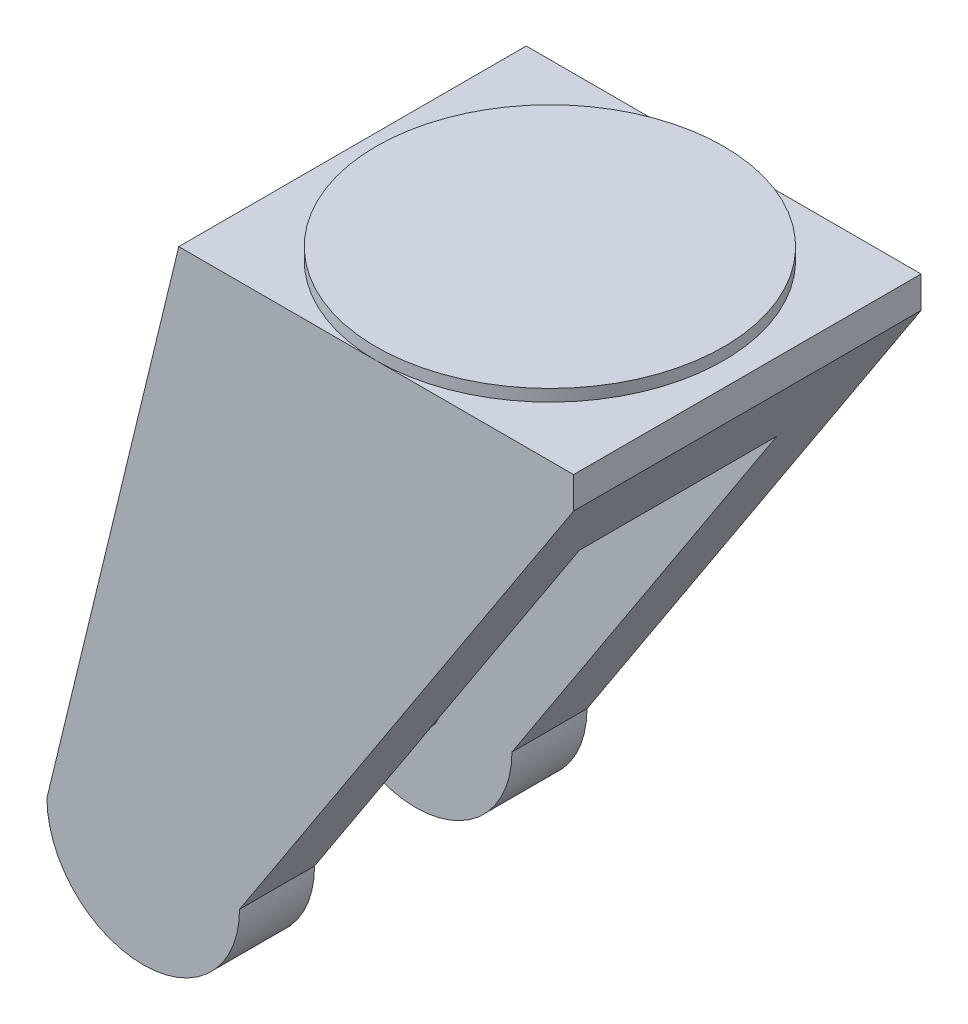
ISO-10303-21;
HEADER;
FILE_DESCRIPTION(('STEP AP214'),'2;1');
FILE_NAME('part.step','',(''),(''),'','','');
FILE_SCHEMA(('AUTOMOTIVE_DESIGN { 1 0 10303 214 1 1 1 1 }'));
ENDSEC;
DATA;
#1=APPLICATION_CONTEXT('core data for automotive mechanical design processes');
#2=APPLICATION_PROTOCOL_DEFINITION('international standard','automotive_design',2000,#1);
#3=PRODUCT_CONTEXT('',#1,'mechanical');
#4=PRODUCT('Part','Part','',(#3));
#5=PRODUCT_RELATED_PRODUCT_CATEGORY('part','',(#4));
#6=PRODUCT_DEFINITION_FORMATION('','',#4);
#7=PRODUCT_DEFINITION_CONTEXT('part definition',#1,'design');
#8=PRODUCT_DEFINITION('design','',#6,#7);
#9=PRODUCT_DEFINITION_SHAPE('','',#8);
#10=(LENGTH_UNIT() NAMED_UNIT(*) SI_UNIT(.MILLI.,.METRE.));
#11=(NAMED_UNIT(*) PLANE_ANGLE_UNIT() SI_UNIT($,.RADIAN.));
#12=(NAMED_UNIT(*) SI_UNIT($,.STERADIAN.) SOLID_ANGLE_UNIT());
#13=UNCERTAINTY_MEASURE_WITH_UNIT(LENGTH_MEASURE(1.E-05),#10,'distance_accuracy_value','');
#14=(GEOMETRIC_REPRESENTATION_CONTEXT(3) GLOBAL_UNCERTAINTY_ASSIGNED_CONTEXT((#13)) GLOBAL_UNIT_ASSIGNED_CONTEXT((#10,
#11,#12)) REPRESENTATION_CONTEXT('',''));
#15=CARTESIAN_POINT('',(0.,0.,0.));
#16=DIRECTION('',(0.,0.,1.));
#17=DIRECTION('',(1.,0.,0.));
#18=AXIS2_PLACEMENT_3D('',#15,#16,#17);
#19=CARTESIAN_POINT('',(-50.,3.99999999999999,88.));
#20=DIRECTION('',(0.,-1.,0.));
#21=DIRECTION('',(1.,0.,0.));
#22=AXIS2_PLACEMENT_3D('',#19,#20,#21);
#23=PLANE('',#22);
#24=CARTESIAN_POINT('',(0.,4.,44.));
#25=DIRECTION('',(0.,1.,0.));
#26=DIRECTION('',(-1.,0.,0.));
#27=AXIS2_PLACEMENT_3D('',#24,#25,#26);
#28=CIRCLE('',#27,44.);
#29=CARTESIAN_POINT('',(0.,4.,88.));
#30=VERTEX_POINT('',#29);
#31=CARTESIAN_POINT('',(0.,4.,0.));
#32=VERTEX_POINT('',#31);
#33=EDGE_CURVE('E44',#30,#32,#28,.T.);
#34=ORIENTED_EDGE('',*,*,#33,.F.);
#35=DIRECTION('',(-1.,0.,0.));
#36=VECTOR('',#35,1.);
#37=CARTESIAN_POINT('',(-50.,3.99999999999999,88.));
#38=LINE('',#37,#36);
#39=CARTESIAN_POINT('',(50.,4.00000000000001,88.));
#40=VERTEX_POINT('',#39);
#41=EDGE_CURVE('E112',#40,#30,#38,.T.);
#42=ORIENTED_EDGE('',*,*,#41,.F.);
#43=DIRECTION('',(0.,0.,-1.));
#44=VECTOR('',#43,1.);
#45=CARTESIAN_POINT('',(50.,4.00000000000001,88.));
#46=LINE('',#45,#44);
#47=CARTESIAN_POINT('',(50.,4.00000000000001,0.));
#48=VERTEX_POINT('',#47);
#49=EDGE_CURVE('E175',#40,#48,#46,.T.);
#50=ORIENTED_EDGE('',*,*,#49,.T.);
#51=DIRECTION('',(-1.,0.,0.));
#52=VECTOR('',#51,1.);
#53=CARTESIAN_POINT('',(-50.,3.99999999999999,0.));
#54=LINE('',#53,#52);
#55=EDGE_CURVE('E131',#48,#32,#54,.T.);
#56=ORIENTED_EDGE('',*,*,#55,.T.);
#57=EDGE_LOOP('',(#34,#42,#50,#56));
#58=FACE_BOUND('',#57,.T.);
#59=ADVANCED_FACE('F34',(#58),#23,.F.);
#60=CARTESIAN_POINT('',(-59.,-133.65,88.));
#61=DIRECTION('',(0.,0.,-1.));
#62=DIRECTION('',(-1.,0.,0.));
#63=AXIS2_PLACEMENT_3D('',#60,#61,#62);
#64=CYLINDRICAL_SURFACE('',#63,24.39);
#65=DIRECTION('',(0.,0.,-1.));
#66=VECTOR('',#65,1.);
#67=CARTESIAN_POINT('',(-83.39,-133.65,88.));
#68=LINE('',#67,#66);
#69=CARTESIAN_POINT('',(-83.39,-133.65,88.));
#70=VERTEX_POINT('',#69);
#71=CARTESIAN_POINT('',(-83.39,-133.65,69.0000000000001));
#72=VERTEX_POINT('',#71);
#73=EDGE_CURVE('E202',#70,#72,#68,.T.);
#74=ORIENTED_EDGE('',*,*,#73,.T.);
#75=CARTESIAN_POINT('',(-59.,-133.65,69.));
#76=DIRECTION('',(0.,0.,1.));
#77=DIRECTION('',(0.,-1.,0.));
#78=AXIS2_PLACEMENT_3D('',#75,#76,#77);
#79=CIRCLE('',#78,24.39);
#80=CARTESIAN_POINT('',(-34.61,-133.65,69.));
#81=VERTEX_POINT('',#80);
#82=EDGE_CURVE('E208',#72,#81,#79,.T.);
#83=ORIENTED_EDGE('',*,*,#82,.T.);
#84=DIRECTION('',(0.,0.,-1.));
#85=VECTOR('',#84,1.);
#86=CARTESIAN_POINT('',(-34.61,-133.65,88.));
#87=LINE('',#86,#85);
#88=CARTESIAN_POINT('',(-34.61,-133.65,88.));
#89=VERTEX_POINT('',#88);
#90=EDGE_CURVE('E197',#89,#81,#87,.T.);
#91=ORIENTED_EDGE('',*,*,#90,.F.);
#92=CARTESIAN_POINT('',(-59.,-133.65,88.));
#93=DIRECTION('',(0.,0.,1.));
#94=DIRECTION('',(1.,0.,0.));
#95=AXIS2_PLACEMENT_3D('',#92,#93,#94);
#96=CIRCLE('',#95,24.39);
#97=EDGE_CURVE('E244',#70,#89,#96,.T.);
#98=ORIENTED_EDGE('',*,*,#97,.F.);
#99=EDGE_LOOP('',(#74,#83,#91,#98));
#100=FACE_BOUND('',#99,.T.);
#101=ADVANCED_FACE('F151',(#100),#64,.T.);
#102=CARTESIAN_POINT('',(50.,-3.99999999999999,88.));
#103=DIRECTION('',(-0.837446078446311,0.546519959100211,0.));
#104=DIRECTION('',(-0.546519959100211,-0.837446078446311,0.));
#105=AXIS2_PLACEMENT_3D('',#102,#103,#104);
#106=PLANE('',#105);
#107=ORIENTED_EDGE('',*,*,#90,.T.);
#108=DIRECTION('',(0.546519959100211,0.837446078446311,0.));
#109=VECTOR('',#108,1.);
#110=CARTESIAN_POINT('',(50.,-3.99999999999999,69.));
#111=LINE('',#110,#109);
#112=CARTESIAN_POINT('',(32.4808681064405,-30.8449999999999,69.));
#113=VERTEX_POINT('',#112);
#114=EDGE_CURVE('E236',#81,#113,#111,.T.);
#115=ORIENTED_EDGE('',*,*,#114,.T.);
#116=DIRECTION('',(0.,0.,-1.));
#117=VECTOR('',#116,1.);
#118=CARTESIAN_POINT('',(32.4808681064405,-30.8449999999999,88.));
#119=LINE('',#118,#117);
#120=CARTESIAN_POINT('',(32.4808681064404,-30.845,19.));
#121=VERTEX_POINT('',#120);
#122=EDGE_CURVE('E239',#113,#121,#119,.T.);
#123=ORIENTED_EDGE('',*,*,#122,.T.);
#124=DIRECTION('',(-0.546519959100211,-0.837446078446311,0.));
#125=VECTOR('',#124,1.);
#126=CARTESIAN_POINT('',(50.,-3.99999999999999,19.));
#127=LINE('',#126,#125);
#128=CARTESIAN_POINT('',(-34.61,-133.65,19.));
#129=VERTEX_POINT('',#128);
#130=EDGE_CURVE('E225',#121,#129,#127,.T.);
#131=ORIENTED_EDGE('',*,*,#130,.T.);
#132=CARTESIAN_POINT('',(-34.61,-133.65,0.));
#133=VERTEX_POINT('',#132);
#134=EDGE_CURVE('E201',#129,#133,#87,.T.);
#135=ORIENTED_EDGE('',*,*,#134,.T.);
#136=DIRECTION('',(0.546519959100211,0.837446078446311,0.));
#137=VECTOR('',#136,1.);
#138=CARTESIAN_POINT('',(50.,-3.99999999999999,0.));
#139=LINE('',#138,#137);
#140=CARTESIAN_POINT('',(50.,-3.99999999999999,0.));
#141=VERTEX_POINT('',#140);
#142=EDGE_CURVE('E182',#133,#141,#139,.T.);
#143=ORIENTED_EDGE('',*,*,#142,.T.);
#144=DIRECTION('',(0.,0.,-1.));
#145=VECTOR('',#144,1.);
#146=CARTESIAN_POINT('',(50.,-3.99999999999999,88.));
#147=LINE('',#146,#145);
#148=CARTESIAN_POINT('',(50.,-3.99999999999999,88.));
#149=VERTEX_POINT('',#148);
#150=EDGE_CURVE('E177',#149,#141,#147,.T.);
#151=ORIENTED_EDGE('',*,*,#150,.F.);
#152=DIRECTION('',(0.546519959100211,0.837446078446311,0.));
#153=VECTOR('',#152,1.);
#154=CARTESIAN_POINT('',(50.,-3.99999999999999,88.));
#155=LINE('',#154,#153);
#156=EDGE_CURVE('E196',#89,#149,#155,.T.);
#157=ORIENTED_EDGE('',*,*,#156,.F.);
#158=EDGE_LOOP('',(#107,#115,#123,#131,#135,#143,#151,#157));
#159=FACE_BOUND('',#158,.T.);
#160=ADVANCED_FACE('F36',(#159),#106,.F.);
#161=CARTESIAN_POINT('',(50.,4.00000000000001,88.));
#162=DIRECTION('',(-1.,0.,0.));
#163=DIRECTION('',(0.,0.,1.));
#164=AXIS2_PLACEMENT_3D('',#161,#162,#163);
#165=PLANE('',#164);
#166=DIRECTION('',(0.,1.,0.));
#167=VECTOR('',#166,1.);
#168=CARTESIAN_POINT('',(50.,4.00000000000001,0.));
#169=LINE('',#168,#167);
#170=EDGE_CURVE('E174',#141,#48,#169,.T.);
#171=ORIENTED_EDGE('',*,*,#170,.T.);
#172=ORIENTED_EDGE('',*,*,#49,.F.);
#173=DIRECTION('',(0.,1.,0.));
#174=VECTOR('',#173,1.);
#175=CARTESIAN_POINT('',(50.,4.00000000000001,88.));
#176=LINE('',#175,#174);
#177=EDGE_CURVE('E117',#149,#40,#176,.T.);
#178=ORIENTED_EDGE('',*,*,#177,.F.);
#179=ORIENTED_EDGE('',*,*,#150,.T.);
#180=EDGE_LOOP('',(#171,#172,#178,#179));
#181=FACE_BOUND('',#180,.T.);
#182=ADVANCED_FACE('F162',(#181),#165,.F.);
#183=EDGE_CURVE('E11',#32,#30,#28,.T.);
#184=ORIENTED_EDGE('',*,*,#183,.F.);
#185=CARTESIAN_POINT('',(-50.,3.99999999999999,0.));
#186=VERTEX_POINT('',#185);
#187=EDGE_CURVE('E181',#32,#186,#54,.T.);
#188=ORIENTED_EDGE('',*,*,#187,.T.);
#189=DIRECTION('',(0.,0.,-1.));
#190=VECTOR('',#189,1.);
#191=CARTESIAN_POINT('',(-50.,3.99999999999999,88.));
#192=LINE('',#191,#190);
#193=CARTESIAN_POINT('',(-50.,3.99999999999999,88.));
#194=VERTEX_POINT('',#193);
#195=EDGE_CURVE('E126',#194,#186,#192,.T.);
#196=ORIENTED_EDGE('',*,*,#195,.F.);
#197=EDGE_CURVE('E115',#30,#194,#38,.T.);
#198=ORIENTED_EDGE('',*,*,#197,.F.);
#199=EDGE_LOOP('',(#184,#188,#196,#198));
#200=FACE_BOUND('',#199,.T.);
#201=ADVANCED_FACE('F124',(#200),#23,.F.);
#202=CARTESIAN_POINT('',(-50.,3.99999999999999,88.));
#203=DIRECTION('',(0.971817275857904,-0.235735407489251,0.));
#204=DIRECTION('',(0.235735407489251,0.971817275857904,0.));
#205=AXIS2_PLACEMENT_3D('',#202,#203,#204);
#206=PLANE('',#205);
#207=DIRECTION('',(0.,0.,1.));
#208=VECTOR('',#207,1.);
#209=CARTESIAN_POINT('',(-58.4524122775154,-30.8449999999999,88.));
#210=LINE('',#209,#208);
#211=CARTESIAN_POINT('',(-58.4524122775154,-30.8449999999999,19.));
#212=VERTEX_POINT('',#211);
#213=CARTESIAN_POINT('',(-58.4524122775154,-30.8449999999999,69.));
#214=VERTEX_POINT('',#213);
#215=EDGE_CURVE('E38',#212,#214,#210,.T.);
#216=ORIENTED_EDGE('',*,*,#215,.T.);
#217=DIRECTION('',(-0.235735407489251,-0.971817275857904,0.));
#218=VECTOR('',#217,1.);
#219=CARTESIAN_POINT('',(-50.,4.,69.));
#220=LINE('',#219,#218);
#221=EDGE_CURVE('E214',#214,#72,#220,.T.);
#222=ORIENTED_EDGE('',*,*,#221,.T.);
#223=ORIENTED_EDGE('',*,*,#73,.F.);
#224=DIRECTION('',(-0.235735407489251,-0.971817275857904,0.));
#225=VECTOR('',#224,1.);
#226=CARTESIAN_POINT('',(-50.,3.99999999999999,88.));
#227=LINE('',#226,#225);
#228=EDGE_CURVE('E122',#194,#70,#227,.T.);
#229=ORIENTED_EDGE('',*,*,#228,.F.);
#230=ORIENTED_EDGE('',*,*,#195,.T.);
#231=DIRECTION('',(-0.235735407489251,-0.971817275857904,0.));
#232=VECTOR('',#231,1.);
#233=CARTESIAN_POINT('',(-50.,3.99999999999999,0.));
#234=LINE('',#233,#232);
#235=CARTESIAN_POINT('',(-83.39,-133.65,0.));
#236=VERTEX_POINT('',#235);
#237=EDGE_CURVE('E187',#186,#236,#234,.T.);
#238=ORIENTED_EDGE('',*,*,#237,.T.);
#239=CARTESIAN_POINT('',(-83.39,-133.65,19.));
#240=VERTEX_POINT('',#239);
#241=EDGE_CURVE('E200',#240,#236,#68,.T.);
#242=ORIENTED_EDGE('',*,*,#241,.F.);
#243=DIRECTION('',(0.235735407489251,0.971817275857904,0.));
#244=VECTOR('',#243,1.);
#245=CARTESIAN_POINT('',(-50.,3.99999999999999,19.));
#246=LINE('',#245,#244);
#247=EDGE_CURVE('E57',#240,#212,#246,.T.);
#248=ORIENTED_EDGE('',*,*,#247,.T.);
#249=EDGE_LOOP('',(#216,#222,#223,#229,#230,#238,#242,#248));
#250=FACE_BOUND('',#249,.T.);
#251=ADVANCED_FACE('F161',(#250),#206,.F.);
#252=ORIENTED_EDGE('',*,*,#134,.F.);
#253=CARTESIAN_POINT('',(-59.,-133.65,19.));
#254=DIRECTION('',(0.,0.,-1.));
#255=DIRECTION('',(-1.,0.,0.));
#256=AXIS2_PLACEMENT_3D('',#253,#254,#255);
#257=CIRCLE('',#256,24.39);
#258=EDGE_CURVE('E207',#129,#240,#257,.T.);
#259=ORIENTED_EDGE('',*,*,#258,.T.);
#260=ORIENTED_EDGE('',*,*,#241,.T.);
#261=CARTESIAN_POINT('',(-59.,-133.65,0.));
#262=DIRECTION('',(0.,0.,1.));
#263=DIRECTION('',(1.,0.,0.));
#264=AXIS2_PLACEMENT_3D('',#261,#262,#263);
#265=CIRCLE('',#264,24.39);
#266=EDGE_CURVE('E190',#236,#133,#265,.T.);
#267=ORIENTED_EDGE('',*,*,#266,.T.);
#268=EDGE_LOOP('',(#252,#259,#260,#267));
#269=FACE_BOUND('',#268,.T.);
#270=ADVANCED_FACE('F158',(#269),#64,.T.);
#271=CARTESIAN_POINT('',(-59.,-133.65,88.));
#272=DIRECTION('',(0.,0.,1.));
#273=DIRECTION('',(1.,0.,0.));
#274=AXIS2_PLACEMENT_3D('',#271,#272,#273);
#275=PLANE('',#274);
#276=ORIENTED_EDGE('',*,*,#156,.T.);
#277=ORIENTED_EDGE('',*,*,#177,.T.);
#278=ORIENTED_EDGE('',*,*,#41,.T.);
#279=ORIENTED_EDGE('',*,*,#197,.T.);
#280=ORIENTED_EDGE('',*,*,#228,.T.);
#281=ORIENTED_EDGE('',*,*,#97,.T.);
#282=EDGE_LOOP('',(#276,#277,#278,#279,#280,#281));
#283=FACE_BOUND('',#282,.T.);
#284=ADVANCED_FACE('F114',(#283),#275,.T.);
#285=CARTESIAN_POINT('',(-59.,-133.65,0.));
#286=DIRECTION('',(0.,0.,1.));
#287=DIRECTION('',(1.,0.,0.));
#288=AXIS2_PLACEMENT_3D('',#285,#286,#287);
#289=PLANE('',#288);
#290=ORIENTED_EDGE('',*,*,#142,.F.);
#291=ORIENTED_EDGE('',*,*,#266,.F.);
#292=ORIENTED_EDGE('',*,*,#237,.F.);
#293=ORIENTED_EDGE('',*,*,#187,.F.);
#294=ORIENTED_EDGE('',*,*,#55,.F.);
#295=ORIENTED_EDGE('',*,*,#170,.F.);
#296=EDGE_LOOP('',(#290,#291,#292,#293,#294,#295));
#297=FACE_BOUND('',#296,.T.);
#298=ADVANCED_FACE('F185',(#297),#289,.F.);
#299=CARTESIAN_POINT('',(-83.39,-30.8449999999999,69.));
#300=DIRECTION('',(0.,1.,0.));
#301=DIRECTION('',(0.,0.,1.));
#302=AXIS2_PLACEMENT_3D('',#299,#300,#301);
#303=PLANE('',#302);
#304=DIRECTION('',(1.,0.,0.));
#305=VECTOR('',#304,1.);
#306=CARTESIAN_POINT('',(-83.39,-30.8449999999999,69.));
#307=LINE('',#306,#305);
#308=EDGE_CURVE('E223',#214,#113,#307,.T.);
#309=ORIENTED_EDGE('',*,*,#308,.F.);
#310=ORIENTED_EDGE('',*,*,#215,.F.);
#311=DIRECTION('',(1.,0.,0.));
#312=VECTOR('',#311,1.);
#313=CARTESIAN_POINT('',(-83.39,-30.8449999999999,19.));
#314=LINE('',#313,#312);
#315=EDGE_CURVE('E220',#212,#121,#314,.T.);
#316=ORIENTED_EDGE('',*,*,#315,.T.);
#317=ORIENTED_EDGE('',*,*,#122,.F.);
#318=EDGE_LOOP('',(#309,#310,#316,#317));
#319=FACE_BOUND('',#318,.T.);
#320=ADVANCED_FACE('F219',(#319),#303,.F.);
#321=CARTESIAN_POINT('',(-83.39,-45.8449999999999,69.));
#322=DIRECTION('',(0.,0.,1.));
#323=DIRECTION('',(0.,-1.,0.));
#324=AXIS2_PLACEMENT_3D('',#321,#322,#323);
#325=PLANE('',#324);
#326=CARTESIAN_POINT('',(-59.,-133.65,69.));
#327=DIRECTION('',(0.,0.,1.));
#328=DIRECTION('',(0.,-1.,0.));
#329=AXIS2_PLACEMENT_3D('',#326,#327,#328);
#330=CIRCLE('',#329,6.05);
#331=CARTESIAN_POINT('',(-59.,-139.7,69.));
#332=VERTEX_POINT('',#331);
#333=EDGE_CURVE('E226',#332,#332,#330,.T.);
#334=ORIENTED_EDGE('',*,*,#333,.T.);
#335=EDGE_LOOP('',(#334));
#336=FACE_BOUND('',#335,.T.);
#337=ORIENTED_EDGE('',*,*,#82,.F.);
#338=ORIENTED_EDGE('',*,*,#221,.F.);
#339=ORIENTED_EDGE('',*,*,#308,.T.);
#340=ORIENTED_EDGE('',*,*,#114,.F.);
#341=EDGE_LOOP('',(#337,#338,#339,#340));
#342=FACE_BOUND('',#341,.T.);
#343=ADVANCED_FACE('F251',(#336,#342),#325,.F.);
#344=CARTESIAN_POINT('',(-83.39,-30.8449999999999,19.));
#345=DIRECTION('',(0.,0.,-1.));
#346=DIRECTION('',(-1.,0.,0.));
#347=AXIS2_PLACEMENT_3D('',#344,#345,#346);
#348=PLANE('',#347);
#349=CARTESIAN_POINT('',(-59.,-133.65,19.));
#350=DIRECTION('',(0.,0.,-1.));
#351=DIRECTION('',(-1.,0.,0.));
#352=AXIS2_PLACEMENT_3D('',#349,#350,#351);
#353=CIRCLE('',#352,6.05);
#354=CARTESIAN_POINT('',(-65.05,-133.65,19.));
#355=VERTEX_POINT('',#354);
#356=EDGE_CURVE('E230',#355,#355,#353,.F.);
#357=ORIENTED_EDGE('',*,*,#356,.F.);
#358=EDGE_LOOP('',(#357));
#359=FACE_BOUND('',#358,.T.);
#360=ORIENTED_EDGE('',*,*,#315,.F.);
#361=ORIENTED_EDGE('',*,*,#247,.F.);
#362=ORIENTED_EDGE('',*,*,#258,.F.);
#363=ORIENTED_EDGE('',*,*,#130,.F.);
#364=EDGE_LOOP('',(#360,#361,#362,#363));
#365=FACE_BOUND('',#364,.T.);
#366=ADVANCED_FACE('F146',(#359,#365),#348,.F.);
#367=CARTESIAN_POINT('',(-59.,-133.65,1.88801589528553));
#368=DIRECTION('',(0.,0.,1.));
#369=DIRECTION('',(1.,0.,0.));
#370=AXIS2_PLACEMENT_3D('',#367,#368,#369);
#371=CYLINDRICAL_SURFACE('',#370,6.05);
#372=ORIENTED_EDGE('',*,*,#356,.T.);
#373=EDGE_LOOP('',(#372));
#374=FACE_BOUND('',#373,.T.);
#375=ORIENTED_EDGE('',*,*,#333,.F.);
#376=EDGE_LOOP('',(#375));
#377=FACE_BOUND('',#376,.T.);
#378=ADVANCED_FACE('F137',(#374,#377),#371,.T.);
#379=CARTESIAN_POINT('',(0.,7.,44.));
#380=DIRECTION('',(0.,-1.,0.));
#381=DIRECTION('',(1.,0.,0.));
#382=AXIS2_PLACEMENT_3D('',#379,#380,#381);
#383=CYLINDRICAL_SURFACE('',#382,44.);
#384=CARTESIAN_POINT('',(0.,7.,44.));
#385=DIRECTION('',(0.,1.,0.));
#386=DIRECTION('',(-1.,0.,0.));
#387=AXIS2_PLACEMENT_3D('',#384,#385,#386);
#388=CIRCLE('',#387,44.);
#389=CARTESIAN_POINT('',(-44.,6.99999999999999,44.));
#390=VERTEX_POINT('',#389);
#391=EDGE_CURVE('E133',#390,#390,#388,.T.);
#392=ORIENTED_EDGE('',*,*,#391,.F.);
#393=EDGE_LOOP('',(#392));
#394=FACE_BOUND('',#393,.T.);
#395=ORIENTED_EDGE('',*,*,#33,.T.);
#396=ORIENTED_EDGE('',*,*,#183,.T.);
#397=EDGE_LOOP('',(#395,#396));
#398=FACE_BOUND('',#397,.T.);
#399=ADVANCED_FACE('F134',(#394,#398),#383,.T.);
#400=CARTESIAN_POINT('',(0.,7.,44.));
#401=DIRECTION('',(0.,1.,0.));
#402=DIRECTION('',(-1.,0.,0.));
#403=AXIS2_PLACEMENT_3D('',#400,#401,#402);
#404=PLANE('',#403);
#405=ORIENTED_EDGE('',*,*,#391,.T.);
#406=EDGE_LOOP('',(#405));
#407=FACE_BOUND('',#406,.T.);
#408=ADVANCED_FACE('F136',(#407),#404,.T.);
#409=CLOSED_SHELL('',(#59,#101,#160,#182,#201,#251,#270,#284,#298,#320,#343,#366,#378,#399,#408));
#410=MANIFOLD_SOLID_BREP('B2',#409);
#411=ADVANCED_BREP_SHAPE_REPRESENTATION('',(#18,#410),#14);
#412=SHAPE_DEFINITION_REPRESENTATION(#9,#411);
ENDSEC;
END-ISO-10303-21;
